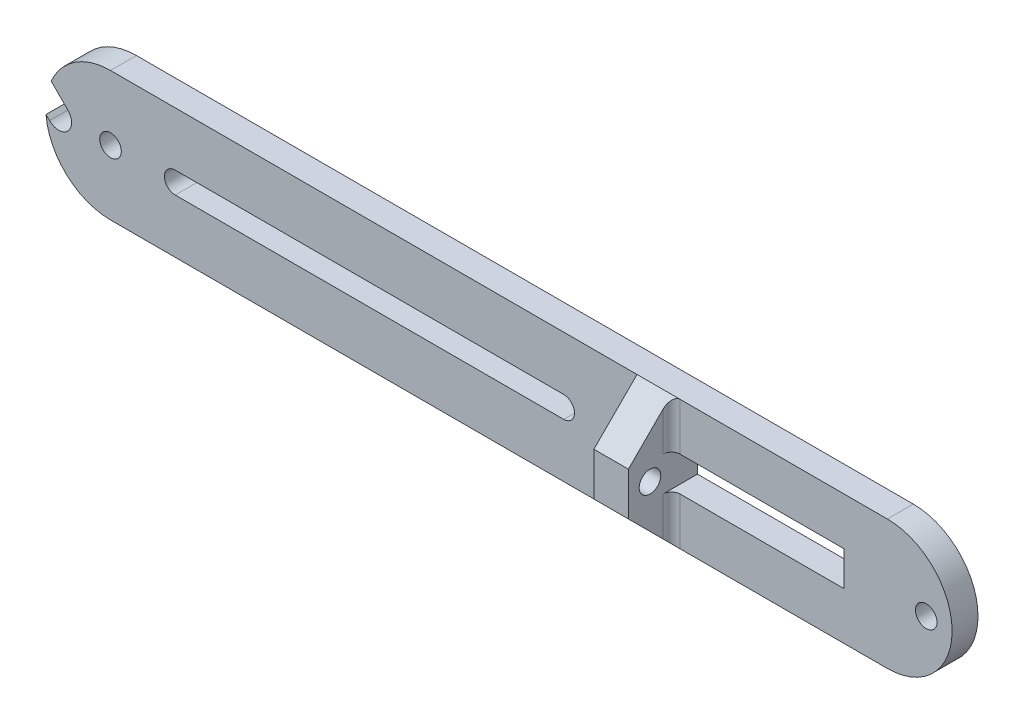
ISO-10303-21;
HEADER;
FILE_DESCRIPTION(('STEP AP214'),'2;1');
FILE_NAME('part.step','',(''),(''),'','','');
FILE_SCHEMA(('AUTOMOTIVE_DESIGN { 1 0 10303 214 1 1 1 1 }'));
ENDSEC;
DATA;
#1=APPLICATION_CONTEXT('core data for automotive mechanical design processes');
#2=APPLICATION_PROTOCOL_DEFINITION('international standard','automotive_design',2000,#1);
#3=PRODUCT_CONTEXT('',#1,'mechanical');
#4=PRODUCT('Part','Part','',(#3));
#5=PRODUCT_RELATED_PRODUCT_CATEGORY('part','',(#4));
#6=PRODUCT_DEFINITION_FORMATION('','',#4);
#7=PRODUCT_DEFINITION_CONTEXT('part definition',#1,'design');
#8=PRODUCT_DEFINITION('design','',#6,#7);
#9=PRODUCT_DEFINITION_SHAPE('','',#8);
#10=(LENGTH_UNIT() NAMED_UNIT(*) SI_UNIT(.MILLI.,.METRE.));
#11=(NAMED_UNIT(*) PLANE_ANGLE_UNIT() SI_UNIT($,.RADIAN.));
#12=(NAMED_UNIT(*) SI_UNIT($,.STERADIAN.) SOLID_ANGLE_UNIT());
#13=UNCERTAINTY_MEASURE_WITH_UNIT(LENGTH_MEASURE(1.E-05),#10,'distance_accuracy_value','');
#14=(GEOMETRIC_REPRESENTATION_CONTEXT(3) GLOBAL_UNCERTAINTY_ASSIGNED_CONTEXT((#13)) GLOBAL_UNIT_ASSIGNED_CONTEXT((#10,
#11,#12)) REPRESENTATION_CONTEXT('',''));
#15=CARTESIAN_POINT('',(0.,0.,0.));
#16=DIRECTION('',(0.,0.,1.));
#17=DIRECTION('',(1.,0.,0.));
#18=AXIS2_PLACEMENT_3D('',#15,#16,#17);
#19=CARTESIAN_POINT('',(90.,0.,6.));
#20=DIRECTION('',(0.,0.,1.));
#21=DIRECTION('',(1.,0.,0.));
#22=AXIS2_PLACEMENT_3D('',#19,#20,#21);
#23=PLANE('',#22);
#24=DIRECTION('',(-1.,0.,0.));
#25=VECTOR('',#24,1.);
#26=CARTESIAN_POINT('',(0.,2.5,6.));
#27=LINE('',#26,#25);
#28=CARTESIAN_POINT('',(15.,2.5,6.));
#29=VERTEX_POINT('',#28);
#30=CARTESIAN_POINT('',(-75.,2.50000000000001,6.));
#31=VERTEX_POINT('',#30);
#32=EDGE_CURVE('E442',#29,#31,#27,.T.);
#33=ORIENTED_EDGE('',*,*,#32,.F.);
#34=CARTESIAN_POINT('',(15.,0.,6.));
#35=DIRECTION('',(0.,0.,1.));
#36=DIRECTION('',(1.,0.,0.));
#37=AXIS2_PLACEMENT_3D('',#34,#35,#36);
#38=CIRCLE('',#37,2.5);
#39=CARTESIAN_POINT('',(15.,-2.5,6.));
#40=VERTEX_POINT('',#39);
#41=EDGE_CURVE('E439',#40,#29,#38,.T.);
#42=ORIENTED_EDGE('',*,*,#41,.F.);
#43=DIRECTION('',(1.,0.,0.));
#44=VECTOR('',#43,1.);
#45=CARTESIAN_POINT('',(15.,-2.5,6.));
#46=LINE('',#45,#44);
#47=CARTESIAN_POINT('',(-75.,-2.50000000000001,6.));
#48=VERTEX_POINT('',#47);
#49=EDGE_CURVE('E437',#48,#40,#46,.T.);
#50=ORIENTED_EDGE('',*,*,#49,.F.);
#51=CARTESIAN_POINT('',(-75.,0.,6.));
#52=DIRECTION('',(0.,0.,1.));
#53=DIRECTION('',(1.,0.,0.));
#54=AXIS2_PLACEMENT_3D('',#51,#52,#53);
#55=CIRCLE('',#54,2.50000000000001);
#56=EDGE_CURVE('E444',#31,#48,#55,.T.);
#57=ORIENTED_EDGE('',*,*,#56,.F.);
#58=EDGE_LOOP('',(#33,#42,#50,#57));
#59=FACE_BOUND('',#58,.T.);
#60=CARTESIAN_POINT('',(-90.,0.,6.));
#61=DIRECTION('',(0.,0.,1.));
#62=DIRECTION('',(-1.,0.,0.));
#63=AXIS2_PLACEMENT_3D('',#60,#61,#62);
#64=CIRCLE('',#63,2.5);
#65=CARTESIAN_POINT('',(-92.5,0.,6.));
#66=VERTEX_POINT('',#65);
#67=EDGE_CURVE('E412',#66,#66,#64,.T.);
#68=ORIENTED_EDGE('',*,*,#67,.F.);
#69=EDGE_LOOP('',(#68));
#70=FACE_BOUND('',#69,.T.);
#71=CARTESIAN_POINT('',(-102.,0.,6.));
#72=DIRECTION('',(0.,0.,1.));
#73=DIRECTION('',(1.,0.,0.));
#74=AXIS2_PLACEMENT_3D('',#71,#72,#73);
#75=CIRCLE('',#74,3.00000000000001);
#76=CARTESIAN_POINT('',(-104.12132034356,-2.12132034355964,6.));
#77=VERTEX_POINT('',#76);
#78=CARTESIAN_POINT('',(-99.8786796564403,2.12132034355964,6.));
#79=VERTEX_POINT('',#78);
#80=EDGE_CURVE('E224',#77,#79,#75,.T.);
#81=ORIENTED_EDGE('',*,*,#80,.F.);
#82=DIRECTION('',(-0.707106781186549,0.707106781186547,0.));
#83=VECTOR('',#82,1.);
#84=CARTESIAN_POINT('',(-53.1213203435595,-53.1213203435596,6.));
#85=LINE('',#84,#83);
#86=CARTESIAN_POINT('',(-104.943648089812,-1.29899259730732,6.));
#87=VERTEX_POINT('',#86);
#88=EDGE_CURVE('E230',#77,#87,#85,.T.);
#89=ORIENTED_EDGE('',*,*,#88,.T.);
#90=CARTESIAN_POINT('',(-90.,0.,6.));
#91=DIRECTION('',(0.,0.,1.));
#92=DIRECTION('',(-1.,0.,0.));
#93=AXIS2_PLACEMENT_3D('',#90,#91,#92);
#94=CIRCLE('',#93,15.);
#95=CARTESIAN_POINT('',(-90.,-15.,6.));
#96=VERTEX_POINT('',#95);
#97=EDGE_CURVE('E374',#87,#96,#94,.T.);
#98=ORIENTED_EDGE('',*,*,#97,.T.);
#99=DIRECTION('',(1.,0.,0.));
#100=VECTOR('',#99,1.);
#101=CARTESIAN_POINT('',(90.,-15.,6.));
#102=LINE('',#101,#100);
#103=CARTESIAN_POINT('',(32.,-15.,6.));
#104=VERTEX_POINT('',#103);
#105=EDGE_CURVE('E376',#96,#104,#102,.T.);
#106=ORIENTED_EDGE('',*,*,#105,.T.);
#107=DIRECTION('',(0.,1.,0.));
#108=VECTOR('',#107,1.);
#109=CARTESIAN_POINT('',(32.,-15.,6.));
#110=LINE('',#109,#108);
#111=CARTESIAN_POINT('',(32.,15.,6.));
#112=VERTEX_POINT('',#111);
#113=EDGE_CURVE('E302',#104,#112,#110,.T.);
#114=ORIENTED_EDGE('',*,*,#113,.T.);
#115=DIRECTION('',(-1.,0.,0.));
#116=VECTOR('',#115,1.);
#117=CARTESIAN_POINT('',(90.,15.,6.));
#118=LINE('',#117,#116);
#119=CARTESIAN_POINT('',(-90.,15.,6.));
#120=VERTEX_POINT('',#119);
#121=EDGE_CURVE('E372',#112,#120,#118,.T.);
#122=ORIENTED_EDGE('',*,*,#121,.T.);
#123=CARTESIAN_POINT('',(-103.750652312537,5.99329299965609,6.));
#124=VERTEX_POINT('',#123);
#125=EDGE_CURVE('E368',#120,#124,#94,.T.);
#126=ORIENTED_EDGE('',*,*,#125,.T.);
#127=DIRECTION('',(-0.707106781186548,0.707106781186547,0.));
#128=VECTOR('',#127,1.);
#129=CARTESIAN_POINT('',(-48.8786796564403,-48.8786796564403,6.));
#130=LINE('',#129,#128);
#131=EDGE_CURVE('E49',#79,#124,#130,.T.);
#132=ORIENTED_EDGE('',*,*,#131,.F.);
#133=EDGE_LOOP('',(#81,#89,#98,#106,#114,#122,#126,#132));
#134=FACE_BOUND('',#133,.T.);
#135=ADVANCED_FACE('F34',(#59,#70,#134),#23,.T.);
#136=CARTESIAN_POINT('',(90.,0.,0.));
#137=DIRECTION('',(0.,0.,1.));
#138=DIRECTION('',(1.,0.,0.));
#139=AXIS2_PLACEMENT_3D('',#136,#137,#138);
#140=PLANE('',#139);
#141=CARTESIAN_POINT('',(99.,0.,0.));
#142=DIRECTION('',(0.,0.,1.));
#143=DIRECTION('',(1.,0.,0.));
#144=AXIS2_PLACEMENT_3D('',#141,#142,#143);
#145=CIRCLE('',#144,2.49999999999999);
#146=CARTESIAN_POINT('',(101.5,0.,0.));
#147=VERTEX_POINT('',#146);
#148=EDGE_CURVE('E312',#147,#147,#145,.T.);
#149=ORIENTED_EDGE('',*,*,#148,.T.);
#150=EDGE_LOOP('',(#149));
#151=FACE_BOUND('',#150,.T.);
#152=CARTESIAN_POINT('',(-90.,0.,0.));
#153=DIRECTION('',(0.,0.,1.));
#154=DIRECTION('',(-1.,0.,0.));
#155=AXIS2_PLACEMENT_3D('',#152,#153,#154);
#156=CIRCLE('',#155,2.5);
#157=CARTESIAN_POINT('',(-92.5,0.,0.));
#158=VERTEX_POINT('',#157);
#159=EDGE_CURVE('E409',#158,#158,#156,.T.);
#160=ORIENTED_EDGE('',*,*,#159,.T.);
#161=EDGE_LOOP('',(#160));
#162=FACE_BOUND('',#161,.T.);
#163=DIRECTION('',(0.,1.,0.));
#164=VECTOR('',#163,1.);
#165=CARTESIAN_POINT('',(80.,-4.,0.));
#166=LINE('',#165,#164);
#167=CARTESIAN_POINT('',(80.,-4.,0.));
#168=VERTEX_POINT('',#167);
#169=CARTESIAN_POINT('',(80.,4.,0.));
#170=VERTEX_POINT('',#169);
#171=EDGE_CURVE('E415',#168,#170,#166,.T.);
#172=ORIENTED_EDGE('',*,*,#171,.T.);
#173=DIRECTION('',(-1.,0.,0.));
#174=VECTOR('',#173,1.);
#175=CARTESIAN_POINT('',(40.,4.,0.));
#176=LINE('',#175,#174);
#177=CARTESIAN_POINT('',(40.,4.,0.));
#178=VERTEX_POINT('',#177);
#179=EDGE_CURVE('E423',#170,#178,#176,.T.);
#180=ORIENTED_EDGE('',*,*,#179,.T.);
#181=DIRECTION('',(0.,-1.,0.));
#182=VECTOR('',#181,1.);
#183=CARTESIAN_POINT('',(40.,-4.,0.));
#184=LINE('',#183,#182);
#185=CARTESIAN_POINT('',(40.,-4.,0.));
#186=VERTEX_POINT('',#185);
#187=EDGE_CURVE('E426',#178,#186,#184,.T.);
#188=ORIENTED_EDGE('',*,*,#187,.T.);
#189=DIRECTION('',(1.,0.,0.));
#190=VECTOR('',#189,1.);
#191=CARTESIAN_POINT('',(40.,-4.,0.));
#192=LINE('',#191,#190);
#193=EDGE_CURVE('E420',#186,#168,#192,.T.);
#194=ORIENTED_EDGE('',*,*,#193,.T.);
#195=EDGE_LOOP('',(#172,#180,#188,#194));
#196=FACE_BOUND('',#195,.T.);
#197=CARTESIAN_POINT('',(15.,0.,0.));
#198=DIRECTION('',(0.,0.,1.));
#199=DIRECTION('',(1.,0.,0.));
#200=AXIS2_PLACEMENT_3D('',#197,#198,#199);
#201=CIRCLE('',#200,2.5);
#202=CARTESIAN_POINT('',(15.,-2.5,0.));
#203=VERTEX_POINT('',#202);
#204=CARTESIAN_POINT('',(15.,2.5,0.));
#205=VERTEX_POINT('',#204);
#206=EDGE_CURVE('E436',#203,#205,#201,.T.);
#207=ORIENTED_EDGE('',*,*,#206,.T.);
#208=DIRECTION('',(-1.,0.,0.));
#209=VECTOR('',#208,1.);
#210=CARTESIAN_POINT('',(0.,2.5,0.));
#211=LINE('',#210,#209);
#212=CARTESIAN_POINT('',(-75.,2.50000000000001,0.));
#213=VERTEX_POINT('',#212);
#214=EDGE_CURVE('E450',#205,#213,#211,.T.);
#215=ORIENTED_EDGE('',*,*,#214,.T.);
#216=CARTESIAN_POINT('',(-75.,0.,0.));
#217=DIRECTION('',(0.,0.,1.));
#218=DIRECTION('',(1.,0.,0.));
#219=AXIS2_PLACEMENT_3D('',#216,#217,#218);
#220=CIRCLE('',#219,2.50000000000001);
#221=CARTESIAN_POINT('',(-75.,-2.50000000000001,0.));
#222=VERTEX_POINT('',#221);
#223=EDGE_CURVE('E453',#213,#222,#220,.T.);
#224=ORIENTED_EDGE('',*,*,#223,.T.);
#225=DIRECTION('',(1.,0.,0.));
#226=VECTOR('',#225,1.);
#227=CARTESIAN_POINT('',(0.,-2.5,0.));
#228=LINE('',#227,#226);
#229=EDGE_CURVE('E440',#222,#203,#228,.T.);
#230=ORIENTED_EDGE('',*,*,#229,.T.);
#231=EDGE_LOOP('',(#207,#215,#224,#230));
#232=FACE_BOUND('',#231,.T.);
#233=DIRECTION('',(-0.707106781186549,0.707106781186547,0.));
#234=VECTOR('',#233,1.);
#235=CARTESIAN_POINT('',(-8.12132034355938,-98.1213203435596,0.));
#236=LINE('',#235,#234);
#237=CARTESIAN_POINT('',(-104.12132034356,-2.12132034355964,0.));
#238=VERTEX_POINT('',#237);
#239=CARTESIAN_POINT('',(-104.943648089812,-1.29899259730732,0.));
#240=VERTEX_POINT('',#239);
#241=EDGE_CURVE('E244',#238,#240,#236,.T.);
#242=ORIENTED_EDGE('',*,*,#241,.F.);
#243=CARTESIAN_POINT('',(-102.,0.,0.));
#244=DIRECTION('',(0.,0.,1.));
#245=DIRECTION('',(1.,0.,0.));
#246=AXIS2_PLACEMENT_3D('',#243,#244,#245);
#247=CIRCLE('',#246,3.00000000000001);
#248=CARTESIAN_POINT('',(-99.8786796564403,2.12132034355964,0.));
#249=VERTEX_POINT('',#248);
#250=EDGE_CURVE('E11',#238,#249,#247,.T.);
#251=ORIENTED_EDGE('',*,*,#250,.T.);
#252=DIRECTION('',(-0.707106781186548,0.707106781186547,0.));
#253=VECTOR('',#252,1.);
#254=CARTESIAN_POINT('',(-3.87867965644033,-93.8786796564403,0.));
#255=LINE('',#254,#253);
#256=CARTESIAN_POINT('',(-103.750652312537,5.99329299965609,0.));
#257=VERTEX_POINT('',#256);
#258=EDGE_CURVE('E240',#249,#257,#255,.T.);
#259=ORIENTED_EDGE('',*,*,#258,.T.);
#260=CARTESIAN_POINT('',(-90.,0.,0.));
#261=DIRECTION('',(0.,0.,1.));
#262=DIRECTION('',(-1.,0.,0.));
#263=AXIS2_PLACEMENT_3D('',#260,#261,#262);
#264=CIRCLE('',#263,15.);
#265=CARTESIAN_POINT('',(-90.,15.,0.));
#266=VERTEX_POINT('',#265);
#267=EDGE_CURVE('E370',#266,#257,#264,.T.);
#268=ORIENTED_EDGE('',*,*,#267,.F.);
#269=DIRECTION('',(-1.,0.,0.));
#270=VECTOR('',#269,1.);
#271=CARTESIAN_POINT('',(90.,15.,0.));
#272=LINE('',#271,#270);
#273=CARTESIAN_POINT('',(90.,15.,0.));
#274=VERTEX_POINT('',#273);
#275=EDGE_CURVE('E532',#274,#266,#272,.T.);
#276=ORIENTED_EDGE('',*,*,#275,.F.);
#277=CARTESIAN_POINT('',(90.,0.,0.));
#278=DIRECTION('',(0.,0.,1.));
#279=DIRECTION('',(1.,0.,0.));
#280=AXIS2_PLACEMENT_3D('',#277,#278,#279);
#281=CIRCLE('',#280,15.);
#282=CARTESIAN_POINT('',(90.,-15.,0.));
#283=VERTEX_POINT('',#282);
#284=EDGE_CURVE('E383',#283,#274,#281,.T.);
#285=ORIENTED_EDGE('',*,*,#284,.F.);
#286=DIRECTION('',(1.,0.,0.));
#287=VECTOR('',#286,1.);
#288=CARTESIAN_POINT('',(90.,-15.,0.));
#289=LINE('',#288,#287);
#290=CARTESIAN_POINT('',(-90.,-15.,0.));
#291=VERTEX_POINT('',#290);
#292=EDGE_CURVE('E467',#291,#283,#289,.T.);
#293=ORIENTED_EDGE('',*,*,#292,.F.);
#294=EDGE_CURVE('E477',#240,#291,#264,.T.);
#295=ORIENTED_EDGE('',*,*,#294,.F.);
#296=EDGE_LOOP('',(#242,#251,#259,#268,#276,#285,#293,#295));
#297=FACE_BOUND('',#296,.T.);
#298=ADVANCED_FACE('F513',(#151,#162,#196,#232,#297),#140,.F.);
#299=CARTESIAN_POINT('',(-90.,0.,6.));
#300=DIRECTION('',(0.,0.,-1.));
#301=DIRECTION('',(-1.,0.,0.));
#302=AXIS2_PLACEMENT_3D('',#299,#300,#301);
#303=CYLINDRICAL_SURFACE('',#302,15.);
#304=DIRECTION('',(0.,0.,-1.));
#305=VECTOR('',#304,1.);
#306=CARTESIAN_POINT('',(-104.943648089812,-1.29899259730732,6.));
#307=LINE('',#306,#305);
#308=EDGE_CURVE('E42',#240,#87,#307,.F.);
#309=ORIENTED_EDGE('',*,*,#308,.F.);
#310=ORIENTED_EDGE('',*,*,#294,.T.);
#311=DIRECTION('',(0.,0.,-1.));
#312=VECTOR('',#311,1.);
#313=CARTESIAN_POINT('',(-90.,-15.,6.));
#314=LINE('',#313,#312);
#315=EDGE_CURVE('E481',#96,#291,#314,.T.);
#316=ORIENTED_EDGE('',*,*,#315,.F.);
#317=ORIENTED_EDGE('',*,*,#97,.F.);
#318=EDGE_LOOP('',(#309,#310,#316,#317));
#319=FACE_BOUND('',#318,.T.);
#320=ADVANCED_FACE('F548',(#319),#303,.T.);
#321=CARTESIAN_POINT('',(90.,15.,6.));
#322=VERTEX_POINT('',#321);
#323=CARTESIAN_POINT('',(42.,15.,6.));
#324=VERTEX_POINT('',#323);
#325=EDGE_CURVE('E377',#322,#324,#118,.T.);
#326=ORIENTED_EDGE('',*,*,#325,.T.);
#327=DIRECTION('',(0.,1.,0.));
#328=VECTOR('',#327,1.);
#329=CARTESIAN_POINT('',(42.,4.,6.));
#330=LINE('',#329,#328);
#331=CARTESIAN_POINT('',(42.,4.,6.));
#332=VERTEX_POINT('',#331);
#333=EDGE_CURVE('E347',#324,#332,#330,.F.);
#334=ORIENTED_EDGE('',*,*,#333,.T.);
#335=DIRECTION('',(-1.,0.,0.));
#336=VECTOR('',#335,1.);
#337=CARTESIAN_POINT('',(40.,4.,6.));
#338=LINE('',#337,#336);
#339=CARTESIAN_POINT('',(80.,4.,6.));
#340=VERTEX_POINT('',#339);
#341=EDGE_CURVE('E335',#340,#332,#338,.T.);
#342=ORIENTED_EDGE('',*,*,#341,.F.);
#343=DIRECTION('',(0.,1.,0.));
#344=VECTOR('',#343,1.);
#345=CARTESIAN_POINT('',(80.,-4.,6.));
#346=LINE('',#345,#344);
#347=CARTESIAN_POINT('',(80.,-4.,6.));
#348=VERTEX_POINT('',#347);
#349=EDGE_CURVE('E418',#348,#340,#346,.T.);
#350=ORIENTED_EDGE('',*,*,#349,.F.);
#351=DIRECTION('',(1.,0.,0.));
#352=VECTOR('',#351,1.);
#353=CARTESIAN_POINT('',(40.,-4.,6.));
#354=LINE('',#353,#352);
#355=CARTESIAN_POINT('',(42.,-4.,6.));
#356=VERTEX_POINT('',#355);
#357=EDGE_CURVE('E338',#356,#348,#354,.T.);
#358=ORIENTED_EDGE('',*,*,#357,.F.);
#359=DIRECTION('',(0.,1.,0.));
#360=VECTOR('',#359,1.);
#361=CARTESIAN_POINT('',(42.,-15.,6.));
#362=LINE('',#361,#360);
#363=CARTESIAN_POINT('',(42.,-15.,6.));
#364=VERTEX_POINT('',#363);
#365=EDGE_CURVE('E344',#356,#364,#362,.F.);
#366=ORIENTED_EDGE('',*,*,#365,.T.);
#367=CARTESIAN_POINT('',(90.,-15.,6.));
#368=VERTEX_POINT('',#367);
#369=EDGE_CURVE('E341',#364,#368,#102,.T.);
#370=ORIENTED_EDGE('',*,*,#369,.T.);
#371=CARTESIAN_POINT('',(90.,0.,6.));
#372=DIRECTION('',(0.,0.,1.));
#373=DIRECTION('',(1.,0.,0.));
#374=AXIS2_PLACEMENT_3D('',#371,#372,#373);
#375=CIRCLE('',#374,15.);
#376=EDGE_CURVE('E465',#368,#322,#375,.T.);
#377=ORIENTED_EDGE('',*,*,#376,.T.);
#378=EDGE_LOOP('',(#326,#334,#342,#350,#358,#366,#370,#377));
#379=FACE_BOUND('',#378,.T.);
#380=CARTESIAN_POINT('',(99.,0.,6.));
#381=DIRECTION('',(0.,0.,1.));
#382=DIRECTION('',(1.,0.,0.));
#383=AXIS2_PLACEMENT_3D('',#380,#381,#382);
#384=CIRCLE('',#383,2.49999999999999);
#385=CARTESIAN_POINT('',(101.5,0.,6.));
#386=VERTEX_POINT('',#385);
#387=EDGE_CURVE('E406',#386,#386,#384,.T.);
#388=ORIENTED_EDGE('',*,*,#387,.F.);
#389=EDGE_LOOP('',(#388));
#390=FACE_BOUND('',#389,.T.);
#391=ADVANCED_FACE('F488',(#379,#390),#23,.T.);
#392=CARTESIAN_POINT('',(90.,0.,6.));
#393=DIRECTION('',(0.,0.,-1.));
#394=DIRECTION('',(-1.,0.,0.));
#395=AXIS2_PLACEMENT_3D('',#392,#393,#394);
#396=CYLINDRICAL_SURFACE('',#395,15.);
#397=ORIENTED_EDGE('',*,*,#284,.T.);
#398=DIRECTION('',(0.,0.,-1.));
#399=VECTOR('',#398,1.);
#400=CARTESIAN_POINT('',(90.,15.,6.));
#401=LINE('',#400,#399);
#402=EDGE_CURVE('E485',#322,#274,#401,.T.);
#403=ORIENTED_EDGE('',*,*,#402,.F.);
#404=ORIENTED_EDGE('',*,*,#376,.F.);
#405=DIRECTION('',(0.,0.,-1.));
#406=VECTOR('',#405,1.);
#407=CARTESIAN_POINT('',(90.,-15.,6.));
#408=LINE('',#407,#406);
#409=EDGE_CURVE('E390',#368,#283,#408,.T.);
#410=ORIENTED_EDGE('',*,*,#409,.T.);
#411=EDGE_LOOP('',(#397,#403,#404,#410));
#412=FACE_BOUND('',#411,.T.);
#413=ADVANCED_FACE('F530',(#412),#396,.T.);
#414=CARTESIAN_POINT('',(90.,15.,6.));
#415=DIRECTION('',(0.,-1.,0.));
#416=DIRECTION('',(0.,0.,-1.));
#417=AXIS2_PLACEMENT_3D('',#414,#415,#416);
#418=PLANE('',#417);
#419=ORIENTED_EDGE('',*,*,#275,.T.);
#420=DIRECTION('',(0.,0.,-1.));
#421=VECTOR('',#420,1.);
#422=CARTESIAN_POINT('',(-90.,15.,6.));
#423=LINE('',#422,#421);
#424=EDGE_CURVE('E483',#120,#266,#423,.T.);
#425=ORIENTED_EDGE('',*,*,#424,.F.);
#426=ORIENTED_EDGE('',*,*,#121,.F.);
#427=DIRECTION('',(1.,0.,0.));
#428=VECTOR('',#427,1.);
#429=CARTESIAN_POINT('',(32.,15.,6.));
#430=LINE('',#429,#428);
#431=EDGE_CURVE('E319',#112,#324,#430,.T.);
#432=ORIENTED_EDGE('',*,*,#431,.T.);
#433=ORIENTED_EDGE('',*,*,#325,.F.);
#434=ORIENTED_EDGE('',*,*,#402,.T.);
#435=EDGE_LOOP('',(#419,#425,#426,#432,#433,#434));
#436=FACE_BOUND('',#435,.T.);
#437=ADVANCED_FACE('F531',(#436),#418,.F.);
#438=ORIENTED_EDGE('',*,*,#267,.T.);
#439=DIRECTION('',(0.,0.,-1.));
#440=VECTOR('',#439,1.);
#441=CARTESIAN_POINT('',(-103.750652312537,5.99329299965609,6.));
#442=LINE('',#441,#440);
#443=EDGE_CURVE('E360',#257,#124,#442,.F.);
#444=ORIENTED_EDGE('',*,*,#443,.T.);
#445=ORIENTED_EDGE('',*,*,#125,.F.);
#446=ORIENTED_EDGE('',*,*,#424,.T.);
#447=EDGE_LOOP('',(#438,#444,#445,#446));
#448=FACE_BOUND('',#447,.T.);
#449=ADVANCED_FACE('F366',(#448),#303,.T.);
#450=CARTESIAN_POINT('',(90.,-15.,6.));
#451=DIRECTION('',(0.,1.,0.));
#452=DIRECTION('',(0.,0.,1.));
#453=AXIS2_PLACEMENT_3D('',#450,#451,#452);
#454=PLANE('',#453);
#455=ORIENTED_EDGE('',*,*,#292,.T.);
#456=ORIENTED_EDGE('',*,*,#409,.F.);
#457=ORIENTED_EDGE('',*,*,#369,.F.);
#458=DIRECTION('',(1.,0.,0.));
#459=VECTOR('',#458,1.);
#460=CARTESIAN_POINT('',(32.,-15.,6.));
#461=LINE('',#460,#459);
#462=EDGE_CURVE('E310',#104,#364,#461,.T.);
#463=ORIENTED_EDGE('',*,*,#462,.F.);
#464=ORIENTED_EDGE('',*,*,#105,.F.);
#465=ORIENTED_EDGE('',*,*,#315,.T.);
#466=EDGE_LOOP('',(#455,#456,#457,#463,#464,#465));
#467=FACE_BOUND('',#466,.T.);
#468=ADVANCED_FACE('F525',(#467),#454,.F.);
#469=CARTESIAN_POINT('',(15.,0.,6.));
#470=DIRECTION('',(0.,0.,-1.));
#471=DIRECTION('',(-1.,0.,0.));
#472=AXIS2_PLACEMENT_3D('',#469,#470,#471);
#473=CYLINDRICAL_SURFACE('',#472,2.5);
#474=ORIENTED_EDGE('',*,*,#206,.F.);
#475=DIRECTION('',(0.,0.,-1.));
#476=VECTOR('',#475,1.);
#477=CARTESIAN_POINT('',(15.,-2.5,6.));
#478=LINE('',#477,#476);
#479=EDGE_CURVE('E464',#40,#203,#478,.T.);
#480=ORIENTED_EDGE('',*,*,#479,.F.);
#481=ORIENTED_EDGE('',*,*,#41,.T.);
#482=DIRECTION('',(0.,0.,-1.));
#483=VECTOR('',#482,1.);
#484=CARTESIAN_POINT('',(15.,2.5,6.));
#485=LINE('',#484,#483);
#486=EDGE_CURVE('E461',#29,#205,#485,.T.);
#487=ORIENTED_EDGE('',*,*,#486,.T.);
#488=EDGE_LOOP('',(#474,#480,#481,#487));
#489=FACE_BOUND('',#488,.T.);
#490=ADVANCED_FACE('F571',(#489),#473,.F.);
#491=CARTESIAN_POINT('',(0.,2.5,6.));
#492=DIRECTION('',(0.,-1.,0.));
#493=DIRECTION('',(1.,0.,0.));
#494=AXIS2_PLACEMENT_3D('',#491,#492,#493);
#495=PLANE('',#494);
#496=ORIENTED_EDGE('',*,*,#214,.F.);
#497=ORIENTED_EDGE('',*,*,#486,.F.);
#498=ORIENTED_EDGE('',*,*,#32,.T.);
#499=DIRECTION('',(0.,0.,-1.));
#500=VECTOR('',#499,1.);
#501=CARTESIAN_POINT('',(-75.,2.50000000000001,6.));
#502=LINE('',#501,#500);
#503=EDGE_CURVE('E459',#31,#213,#502,.T.);
#504=ORIENTED_EDGE('',*,*,#503,.T.);
#505=EDGE_LOOP('',(#496,#497,#498,#504));
#506=FACE_BOUND('',#505,.T.);
#507=ADVANCED_FACE('F627',(#506),#495,.T.);
#508=CARTESIAN_POINT('',(-75.,0.,6.));
#509=DIRECTION('',(0.,0.,-1.));
#510=DIRECTION('',(-1.,0.,0.));
#511=AXIS2_PLACEMENT_3D('',#508,#509,#510);
#512=CYLINDRICAL_SURFACE('',#511,2.50000000000001);
#513=ORIENTED_EDGE('',*,*,#223,.F.);
#514=ORIENTED_EDGE('',*,*,#503,.F.);
#515=ORIENTED_EDGE('',*,*,#56,.T.);
#516=DIRECTION('',(0.,0.,-1.));
#517=VECTOR('',#516,1.);
#518=CARTESIAN_POINT('',(-75.,-2.50000000000001,6.));
#519=LINE('',#518,#517);
#520=EDGE_CURVE('E447',#48,#222,#519,.T.);
#521=ORIENTED_EDGE('',*,*,#520,.T.);
#522=EDGE_LOOP('',(#513,#514,#515,#521));
#523=FACE_BOUND('',#522,.T.);
#524=ADVANCED_FACE('F623',(#523),#512,.F.);
#525=CARTESIAN_POINT('',(0.,-2.5,6.));
#526=DIRECTION('',(0.,1.,0.));
#527=DIRECTION('',(-1.,0.,0.));
#528=AXIS2_PLACEMENT_3D('',#525,#526,#527);
#529=PLANE('',#528);
#530=ORIENTED_EDGE('',*,*,#229,.F.);
#531=ORIENTED_EDGE('',*,*,#520,.F.);
#532=ORIENTED_EDGE('',*,*,#49,.T.);
#533=ORIENTED_EDGE('',*,*,#479,.T.);
#534=EDGE_LOOP('',(#530,#531,#532,#533));
#535=FACE_BOUND('',#534,.T.);
#536=ADVANCED_FACE('F620',(#535),#529,.T.);
#537=CARTESIAN_POINT('',(80.,-4.,6.));
#538=DIRECTION('',(-1.,0.,0.));
#539=DIRECTION('',(0.,0.,1.));
#540=AXIS2_PLACEMENT_3D('',#537,#538,#539);
#541=PLANE('',#540);
#542=ORIENTED_EDGE('',*,*,#171,.F.);
#543=DIRECTION('',(0.,0.,-1.));
#544=VECTOR('',#543,1.);
#545=CARTESIAN_POINT('',(80.,-4.,6.));
#546=LINE('',#545,#544);
#547=EDGE_CURVE('E330',#348,#168,#546,.T.);
#548=ORIENTED_EDGE('',*,*,#547,.F.);
#549=ORIENTED_EDGE('',*,*,#349,.T.);
#550=DIRECTION('',(0.,0.,-1.));
#551=VECTOR('',#550,1.);
#552=CARTESIAN_POINT('',(80.,4.,6.));
#553=LINE('',#552,#551);
#554=EDGE_CURVE('E433',#340,#170,#553,.T.);
#555=ORIENTED_EDGE('',*,*,#554,.T.);
#556=EDGE_LOOP('',(#542,#548,#549,#555));
#557=FACE_BOUND('',#556,.T.);
#558=ADVANCED_FACE('F508',(#557),#541,.T.);
#559=CARTESIAN_POINT('',(40.,4.,6.));
#560=DIRECTION('',(0.,-1.,0.));
#561=DIRECTION('',(0.,0.,-1.));
#562=AXIS2_PLACEMENT_3D('',#559,#560,#561);
#563=PLANE('',#562);
#564=ORIENTED_EDGE('',*,*,#179,.F.);
#565=ORIENTED_EDGE('',*,*,#554,.F.);
#566=ORIENTED_EDGE('',*,*,#341,.T.);
#567=CARTESIAN_POINT('',(42.,4.,8.));
#568=DIRECTION('',(0.,-1.,0.));
#569=DIRECTION('',(0.,0.,-1.));
#570=AXIS2_PLACEMENT_3D('',#567,#568,#569);
#571=CIRCLE('',#570,2.);
#572=CARTESIAN_POINT('',(40.,4.,8.));
#573=VERTEX_POINT('',#572);
#574=EDGE_CURVE('E353',#332,#573,#571,.F.);
#575=ORIENTED_EDGE('',*,*,#574,.T.);
#576=DIRECTION('',(0.,0.,-1.));
#577=VECTOR('',#576,1.);
#578=CARTESIAN_POINT('',(40.,4.,6.));
#579=LINE('',#578,#577);
#580=EDGE_CURVE('E329',#573,#178,#579,.T.);
#581=ORIENTED_EDGE('',*,*,#580,.T.);
#582=EDGE_LOOP('',(#564,#565,#566,#575,#581));
#583=FACE_BOUND('',#582,.T.);
#584=ADVANCED_FACE('F500',(#583),#563,.T.);
#585=CARTESIAN_POINT('',(40.,-4.,6.));
#586=DIRECTION('',(1.,0.,0.));
#587=DIRECTION('',(0.,0.,-1.));
#588=AXIS2_PLACEMENT_3D('',#585,#586,#587);
#589=PLANE('',#588);
#590=ORIENTED_EDGE('',*,*,#580,.F.);
#591=DIRECTION('',(0.,1.,0.));
#592=VECTOR('',#591,1.);
#593=CARTESIAN_POINT('',(40.,15.,8.));
#594=LINE('',#593,#592);
#595=CARTESIAN_POINT('',(40.,13.,8.));
#596=VERTEX_POINT('',#595);
#597=EDGE_CURVE('E348',#573,#596,#594,.T.);
#598=ORIENTED_EDGE('',*,*,#597,.T.);
#599=DIRECTION('',(0.,-0.707106781186548,0.707106781186548));
#600=VECTOR('',#599,1.);
#601=CARTESIAN_POINT('',(40.,15.,6.));
#602=LINE('',#601,#600);
#603=CARTESIAN_POINT('',(40.,5.,16.));
#604=VERTEX_POINT('',#603);
#605=EDGE_CURVE('E296',#596,#604,#602,.T.);
#606=ORIENTED_EDGE('',*,*,#605,.T.);
#607=DIRECTION('',(0.,-1.,0.));
#608=VECTOR('',#607,1.);
#609=CARTESIAN_POINT('',(40.,5.,16.));
#610=LINE('',#609,#608);
#611=CARTESIAN_POINT('',(40.,-5.,16.));
#612=VERTEX_POINT('',#611);
#613=EDGE_CURVE('E324',#604,#612,#610,.T.);
#614=ORIENTED_EDGE('',*,*,#613,.T.);
#615=DIRECTION('',(0.,-0.707106781186547,-0.707106781186548));
#616=VECTOR('',#615,1.);
#617=CARTESIAN_POINT('',(40.,-15.,6.));
#618=LINE('',#617,#616);
#619=CARTESIAN_POINT('',(40.,-13.,8.));
#620=VERTEX_POINT('',#619);
#621=EDGE_CURVE('E307',#612,#620,#618,.T.);
#622=ORIENTED_EDGE('',*,*,#621,.T.);
#623=DIRECTION('',(0.,1.,0.));
#624=VECTOR('',#623,1.);
#625=CARTESIAN_POINT('',(40.,-4.,8.));
#626=LINE('',#625,#624);
#627=CARTESIAN_POINT('',(40.,-4.,8.));
#628=VERTEX_POINT('',#627);
#629=EDGE_CURVE('E487',#620,#628,#626,.T.);
#630=ORIENTED_EDGE('',*,*,#629,.T.);
#631=DIRECTION('',(0.,0.,-1.));
#632=VECTOR('',#631,1.);
#633=CARTESIAN_POINT('',(40.,-4.,6.));
#634=LINE('',#633,#632);
#635=EDGE_CURVE('E327',#628,#186,#634,.T.);
#636=ORIENTED_EDGE('',*,*,#635,.T.);
#637=ORIENTED_EDGE('',*,*,#187,.F.);
#638=EDGE_LOOP('',(#590,#598,#606,#614,#622,#630,#636,#637));
#639=FACE_BOUND('',#638,.T.);
#640=CARTESIAN_POINT('',(40.,0.,11.));
#641=DIRECTION('',(1.,0.,0.));
#642=DIRECTION('',(0.,0.,-1.));
#643=AXIS2_PLACEMENT_3D('',#640,#641,#642);
#644=CIRCLE('',#643,2.5);
#645=CARTESIAN_POINT('',(40.,0.,8.5));
#646=VERTEX_POINT('',#645);
#647=EDGE_CURVE('E293',#646,#646,#644,.T.);
#648=ORIENTED_EDGE('',*,*,#647,.F.);
#649=EDGE_LOOP('',(#648));
#650=FACE_BOUND('',#649,.T.);
#651=ADVANCED_FACE('F516',(#639,#650),#589,.T.);
#652=CARTESIAN_POINT('',(40.,-4.,6.));
#653=DIRECTION('',(0.,1.,0.));
#654=DIRECTION('',(0.,0.,1.));
#655=AXIS2_PLACEMENT_3D('',#652,#653,#654);
#656=PLANE('',#655);
#657=ORIENTED_EDGE('',*,*,#193,.F.);
#658=ORIENTED_EDGE('',*,*,#635,.F.);
#659=CARTESIAN_POINT('',(42.,-4.,8.));
#660=DIRECTION('',(0.,1.,0.));
#661=DIRECTION('',(0.,0.,1.));
#662=AXIS2_PLACEMENT_3D('',#659,#660,#661);
#663=CIRCLE('',#662,2.);
#664=EDGE_CURVE('E356',#628,#356,#663,.F.);
#665=ORIENTED_EDGE('',*,*,#664,.T.);
#666=ORIENTED_EDGE('',*,*,#357,.T.);
#667=ORIENTED_EDGE('',*,*,#547,.T.);
#668=EDGE_LOOP('',(#657,#658,#665,#666,#667));
#669=FACE_BOUND('',#668,.T.);
#670=ADVANCED_FACE('F511',(#669),#656,.T.);
#671=CARTESIAN_POINT('',(-90.,0.,6.));
#672=DIRECTION('',(0.,0.,-1.));
#673=DIRECTION('',(-1.,0.,0.));
#674=AXIS2_PLACEMENT_3D('',#671,#672,#673);
#675=CYLINDRICAL_SURFACE('',#674,2.5);
#676=ORIENTED_EDGE('',*,*,#67,.T.);
#677=EDGE_LOOP('',(#676));
#678=FACE_BOUND('',#677,.T.);
#679=ORIENTED_EDGE('',*,*,#159,.F.);
#680=EDGE_LOOP('',(#679));
#681=FACE_BOUND('',#680,.T.);
#682=ADVANCED_FACE('F607',(#678,#681),#675,.F.);
#683=CARTESIAN_POINT('',(99.,0.,6.));
#684=DIRECTION('',(0.,0.,-1.));
#685=DIRECTION('',(-1.,0.,0.));
#686=AXIS2_PLACEMENT_3D('',#683,#684,#685);
#687=CYLINDRICAL_SURFACE('',#686,2.49999999999999);
#688=ORIENTED_EDGE('',*,*,#387,.T.);
#689=EDGE_LOOP('',(#688));
#690=FACE_BOUND('',#689,.T.);
#691=ORIENTED_EDGE('',*,*,#148,.F.);
#692=EDGE_LOOP('',(#691));
#693=FACE_BOUND('',#692,.T.);
#694=ADVANCED_FACE('F598',(#690,#693),#687,.F.);
#695=CARTESIAN_POINT('',(32.,-15.,6.));
#696=DIRECTION('',(0.,-0.707106781186548,0.707106781186547));
#697=DIRECTION('',(0.,-0.707106781186547,-0.707106781186548));
#698=AXIS2_PLACEMENT_3D('',#695,#696,#697);
#699=PLANE('',#698);
#700=ORIENTED_EDGE('',*,*,#621,.F.);
#701=DIRECTION('',(1.,0.,0.));
#702=VECTOR('',#701,1.);
#703=CARTESIAN_POINT('',(32.,-5.,16.));
#704=LINE('',#703,#702);
#705=CARTESIAN_POINT('',(32.,-5.,16.));
#706=VERTEX_POINT('',#705);
#707=EDGE_CURVE('E313',#706,#612,#704,.T.);
#708=ORIENTED_EDGE('',*,*,#707,.F.);
#709=DIRECTION('',(0.,-0.707106781186547,-0.707106781186548));
#710=VECTOR('',#709,1.);
#711=CARTESIAN_POINT('',(32.,-15.,6.));
#712=LINE('',#711,#710);
#713=EDGE_CURVE('E316',#706,#104,#712,.T.);
#714=ORIENTED_EDGE('',*,*,#713,.T.);
#715=ORIENTED_EDGE('',*,*,#462,.T.);
#716=CARTESIAN_POINT('',(42.,-13.,8.));
#717=DIRECTION('',(0.,-0.707106781186548,0.707106781186547));
#718=DIRECTION('',(0.,-0.707106781186547,-0.707106781186548));
#719=AXIS2_PLACEMENT_3D('',#716,#717,#718);
#720=ELLIPSE('',#719,2.82842712474619,2.);
#721=EDGE_CURVE('E358',#364,#620,#720,.F.);
#722=ORIENTED_EDGE('',*,*,#721,.T.);
#723=EDGE_LOOP('',(#700,#708,#714,#715,#722));
#724=FACE_BOUND('',#723,.T.);
#725=ADVANCED_FACE('F594',(#724),#699,.T.);
#726=CARTESIAN_POINT('',(32.,5.,16.));
#727=DIRECTION('',(0.,0.,1.));
#728=DIRECTION('',(1.,0.,0.));
#729=AXIS2_PLACEMENT_3D('',#726,#727,#728);
#730=PLANE('',#729);
#731=ORIENTED_EDGE('',*,*,#613,.F.);
#732=DIRECTION('',(1.,0.,0.));
#733=VECTOR('',#732,1.);
#734=CARTESIAN_POINT('',(32.,5.,16.));
#735=LINE('',#734,#733);
#736=CARTESIAN_POINT('',(32.,5.,16.));
#737=VERTEX_POINT('',#736);
#738=EDGE_CURVE('E395',#737,#604,#735,.T.);
#739=ORIENTED_EDGE('',*,*,#738,.F.);
#740=DIRECTION('',(0.,-1.,0.));
#741=VECTOR('',#740,1.);
#742=CARTESIAN_POINT('',(32.,5.,16.));
#743=LINE('',#742,#741);
#744=EDGE_CURVE('E299',#737,#706,#743,.T.);
#745=ORIENTED_EDGE('',*,*,#744,.T.);
#746=ORIENTED_EDGE('',*,*,#707,.T.);
#747=EDGE_LOOP('',(#731,#739,#745,#746));
#748=FACE_BOUND('',#747,.T.);
#749=ADVANCED_FACE('F597',(#748),#730,.T.);
#750=CARTESIAN_POINT('',(32.,15.,6.));
#751=DIRECTION('',(0.,0.707106781186547,0.707106781186547));
#752=DIRECTION('',(0.,-0.707106781186548,0.707106781186548));
#753=AXIS2_PLACEMENT_3D('',#750,#751,#752);
#754=PLANE('',#753);
#755=ORIENTED_EDGE('',*,*,#605,.F.);
#756=CARTESIAN_POINT('',(42.,13.,8.));
#757=DIRECTION('',(0.,0.707106781186547,0.707106781186547));
#758=DIRECTION('',(0.,-0.707106781186548,0.707106781186548));
#759=AXIS2_PLACEMENT_3D('',#756,#757,#758);
#760=ELLIPSE('',#759,2.82842712474619,2.);
#761=EDGE_CURVE('E350',#596,#324,#760,.F.);
#762=ORIENTED_EDGE('',*,*,#761,.T.);
#763=ORIENTED_EDGE('',*,*,#431,.F.);
#764=DIRECTION('',(0.,-0.707106781186548,0.707106781186548));
#765=VECTOR('',#764,1.);
#766=CARTESIAN_POINT('',(32.,15.,6.));
#767=LINE('',#766,#765);
#768=EDGE_CURVE('E306',#112,#737,#767,.T.);
#769=ORIENTED_EDGE('',*,*,#768,.T.);
#770=ORIENTED_EDGE('',*,*,#738,.T.);
#771=EDGE_LOOP('',(#755,#762,#763,#769,#770));
#772=FACE_BOUND('',#771,.T.);
#773=ADVANCED_FACE('F493',(#772),#754,.T.);
#774=CARTESIAN_POINT('',(32.,0.,0.));
#775=DIRECTION('',(1.,0.,0.));
#776=DIRECTION('',(0.,0.,-1.));
#777=AXIS2_PLACEMENT_3D('',#774,#775,#776);
#778=PLANE('',#777);
#779=DIRECTION('',(0.,0.500000000000001,-0.866025403784438));
#780=VECTOR('',#779,1.);
#781=CARTESIAN_POINT('',(32.,4.,11.));
#782=LINE('',#781,#780);
#783=CARTESIAN_POINT('',(32.,1.99999999999999,14.4641016151378));
#784=VERTEX_POINT('',#783);
#785=CARTESIAN_POINT('',(32.,4.,11.));
#786=VERTEX_POINT('',#785);
#787=EDGE_CURVE('E267',#784,#786,#782,.T.);
#788=ORIENTED_EDGE('',*,*,#787,.F.);
#789=DIRECTION('',(0.,1.,0.));
#790=VECTOR('',#789,1.);
#791=CARTESIAN_POINT('',(32.,1.99999999999999,14.4641016151378));
#792=LINE('',#791,#790);
#793=CARTESIAN_POINT('',(32.,-2.00000000000002,14.4641016151377));
#794=VERTEX_POINT('',#793);
#795=EDGE_CURVE('E57',#794,#784,#792,.T.);
#796=ORIENTED_EDGE('',*,*,#795,.F.);
#797=DIRECTION('',(0.,0.499999999999998,0.86602540378444));
#798=VECTOR('',#797,1.);
#799=CARTESIAN_POINT('',(32.,-2.00000000000002,14.4641016151377));
#800=LINE('',#799,#798);
#801=CARTESIAN_POINT('',(32.,-4.,11.));
#802=VERTEX_POINT('',#801);
#803=EDGE_CURVE('E250',#802,#794,#800,.T.);
#804=ORIENTED_EDGE('',*,*,#803,.F.);
#805=DIRECTION('',(0.,-0.499999999999998,0.86602540378444));
#806=VECTOR('',#805,1.);
#807=CARTESIAN_POINT('',(32.,-2.00000000000002,7.53589838486225));
#808=LINE('',#807,#806);
#809=CARTESIAN_POINT('',(32.,-2.00000000000002,7.53589838486225));
#810=VERTEX_POINT('',#809);
#811=EDGE_CURVE('E276',#810,#802,#808,.T.);
#812=ORIENTED_EDGE('',*,*,#811,.F.);
#813=DIRECTION('',(0.,-1.,0.));
#814=VECTOR('',#813,1.);
#815=CARTESIAN_POINT('',(32.,1.99999999999999,7.53589838486224));
#816=LINE('',#815,#814);
#817=CARTESIAN_POINT('',(32.,1.99999999999999,7.53589838486224));
#818=VERTEX_POINT('',#817);
#819=EDGE_CURVE('E273',#818,#810,#816,.T.);
#820=ORIENTED_EDGE('',*,*,#819,.F.);
#821=DIRECTION('',(0.,-0.500000000000001,-0.866025403784438));
#822=VECTOR('',#821,1.);
#823=CARTESIAN_POINT('',(32.,4.,11.));
#824=LINE('',#823,#822);
#825=EDGE_CURVE('E270',#786,#818,#824,.T.);
#826=ORIENTED_EDGE('',*,*,#825,.F.);
#827=EDGE_LOOP('',(#788,#796,#804,#812,#820,#826));
#828=FACE_BOUND('',#827,.T.);
#829=ORIENTED_EDGE('',*,*,#113,.F.);
#830=ORIENTED_EDGE('',*,*,#713,.F.);
#831=ORIENTED_EDGE('',*,*,#744,.F.);
#832=ORIENTED_EDGE('',*,*,#768,.F.);
#833=EDGE_LOOP('',(#829,#830,#831,#832));
#834=FACE_BOUND('',#833,.T.);
#835=ADVANCED_FACE('F581',(#828,#834),#778,.F.);
#836=CARTESIAN_POINT('',(32.,0.,11.));
#837=DIRECTION('',(1.,0.,0.));
#838=DIRECTION('',(0.,0.,-1.));
#839=AXIS2_PLACEMENT_3D('',#836,#837,#838);
#840=CYLINDRICAL_SURFACE('',#839,2.5);
#841=CARTESIAN_POINT('',(36.,0.,11.));
#842=DIRECTION('',(1.,0.,0.));
#843=DIRECTION('',(0.,0.,-1.));
#844=AXIS2_PLACEMENT_3D('',#841,#842,#843);
#845=CIRCLE('',#844,2.5);
#846=CARTESIAN_POINT('',(36.,0.,8.5));
#847=VERTEX_POINT('',#846);
#848=EDGE_CURVE('E283',#847,#847,#845,.F.);
#849=ORIENTED_EDGE('',*,*,#848,.T.);
#850=EDGE_LOOP('',(#849));
#851=FACE_BOUND('',#850,.T.);
#852=ORIENTED_EDGE('',*,*,#647,.T.);
#853=EDGE_LOOP('',(#852));
#854=FACE_BOUND('',#853,.T.);
#855=ADVANCED_FACE('F575',(#851,#854),#840,.F.);
#856=CARTESIAN_POINT('',(42.,-4.,8.));
#857=DIRECTION('',(0.,-1.,0.));
#858=DIRECTION('',(0.,0.,-1.));
#859=AXIS2_PLACEMENT_3D('',#856,#857,#858);
#860=CYLINDRICAL_SURFACE('',#859,2.);
#861=ORIENTED_EDGE('',*,*,#574,.F.);
#862=ORIENTED_EDGE('',*,*,#333,.F.);
#863=ORIENTED_EDGE('',*,*,#761,.F.);
#864=ORIENTED_EDGE('',*,*,#597,.F.);
#865=EDGE_LOOP('',(#861,#862,#863,#864));
#866=FACE_BOUND('',#865,.T.);
#867=ADVANCED_FACE('F498',(#866),#860,.F.);
#868=CARTESIAN_POINT('',(42.,-4.,8.));
#869=DIRECTION('',(0.,-1.,0.));
#870=DIRECTION('',(0.,0.,-1.));
#871=AXIS2_PLACEMENT_3D('',#868,#869,#870);
#872=CYLINDRICAL_SURFACE('',#871,2.);
#873=ORIENTED_EDGE('',*,*,#721,.F.);
#874=ORIENTED_EDGE('',*,*,#365,.F.);
#875=ORIENTED_EDGE('',*,*,#664,.F.);
#876=ORIENTED_EDGE('',*,*,#629,.F.);
#877=EDGE_LOOP('',(#873,#874,#875,#876));
#878=FACE_BOUND('',#877,.T.);
#879=ADVANCED_FACE('F36',(#878),#872,.F.);
#880=CARTESIAN_POINT('',(36.,0.,0.));
#881=DIRECTION('',(1.,0.,0.));
#882=DIRECTION('',(0.,0.,-1.));
#883=AXIS2_PLACEMENT_3D('',#880,#881,#882);
#884=PLANE('',#883);
#885=DIRECTION('',(0.,1.,0.));
#886=VECTOR('',#885,1.);
#887=CARTESIAN_POINT('',(36.,1.99999999999999,14.4641016151378));
#888=LINE('',#887,#886);
#889=CARTESIAN_POINT('',(36.,-2.00000000000002,14.4641016151377));
#890=VERTEX_POINT('',#889);
#891=CARTESIAN_POINT('',(36.,1.99999999999999,14.4641016151378));
#892=VERTEX_POINT('',#891);
#893=EDGE_CURVE('E246',#890,#892,#888,.T.);
#894=ORIENTED_EDGE('',*,*,#893,.T.);
#895=DIRECTION('',(0.,0.500000000000001,-0.866025403784438));
#896=VECTOR('',#895,1.);
#897=CARTESIAN_POINT('',(36.,4.,11.));
#898=LINE('',#897,#896);
#899=CARTESIAN_POINT('',(36.,4.,11.));
#900=VERTEX_POINT('',#899);
#901=EDGE_CURVE('E249',#892,#900,#898,.T.);
#902=ORIENTED_EDGE('',*,*,#901,.T.);
#903=DIRECTION('',(0.,-0.500000000000001,-0.866025403784438));
#904=VECTOR('',#903,1.);
#905=CARTESIAN_POINT('',(36.,4.,11.));
#906=LINE('',#905,#904);
#907=CARTESIAN_POINT('',(36.,1.99999999999999,7.53589838486224));
#908=VERTEX_POINT('',#907);
#909=EDGE_CURVE('E253',#900,#908,#906,.T.);
#910=ORIENTED_EDGE('',*,*,#909,.T.);
#911=DIRECTION('',(0.,-1.,0.));
#912=VECTOR('',#911,1.);
#913=CARTESIAN_POINT('',(36.,1.99999999999999,7.53589838486224));
#914=LINE('',#913,#912);
#915=CARTESIAN_POINT('',(36.,-2.00000000000002,7.53589838486225));
#916=VERTEX_POINT('',#915);
#917=EDGE_CURVE('E256',#908,#916,#914,.T.);
#918=ORIENTED_EDGE('',*,*,#917,.T.);
#919=DIRECTION('',(0.,-0.499999999999998,0.86602540378444));
#920=VECTOR('',#919,1.);
#921=CARTESIAN_POINT('',(36.,-2.00000000000002,7.53589838486225));
#922=LINE('',#921,#920);
#923=CARTESIAN_POINT('',(36.,-4.,11.));
#924=VERTEX_POINT('',#923);
#925=EDGE_CURVE('E259',#916,#924,#922,.T.);
#926=ORIENTED_EDGE('',*,*,#925,.T.);
#927=DIRECTION('',(0.,0.499999999999998,0.86602540378444));
#928=VECTOR('',#927,1.);
#929=CARTESIAN_POINT('',(36.,-2.00000000000002,14.4641016151377));
#930=LINE('',#929,#928);
#931=EDGE_CURVE('E262',#924,#890,#930,.T.);
#932=ORIENTED_EDGE('',*,*,#931,.T.);
#933=EDGE_LOOP('',(#894,#902,#910,#918,#926,#932));
#934=FACE_BOUND('',#933,.T.);
#935=ORIENTED_EDGE('',*,*,#848,.F.);
#936=EDGE_LOOP('',(#935));
#937=FACE_BOUND('',#936,.T.);
#938=ADVANCED_FACE('F580',(#934,#937),#884,.F.);
#939=CARTESIAN_POINT('',(36.,1.99999999999999,14.4641016151378));
#940=DIRECTION('',(0.,0.,1.));
#941=DIRECTION('',(0.,-1.,0.));
#942=AXIS2_PLACEMENT_3D('',#939,#940,#941);
#943=PLANE('',#942);
#944=ORIENTED_EDGE('',*,*,#795,.T.);
#945=DIRECTION('',(-1.,0.,0.));
#946=VECTOR('',#945,1.);
#947=CARTESIAN_POINT('',(36.,1.99999999999999,14.4641016151378));
#948=LINE('',#947,#946);
#949=EDGE_CURVE('E265',#892,#784,#948,.T.);
#950=ORIENTED_EDGE('',*,*,#949,.F.);
#951=ORIENTED_EDGE('',*,*,#893,.F.);
#952=DIRECTION('',(-1.,0.,0.));
#953=VECTOR('',#952,1.);
#954=CARTESIAN_POINT('',(36.,-2.00000000000002,14.4641016151377));
#955=LINE('',#954,#953);
#956=EDGE_CURVE('E281',#890,#794,#955,.T.);
#957=ORIENTED_EDGE('',*,*,#956,.T.);
#958=EDGE_LOOP('',(#944,#950,#951,#957));
#959=FACE_BOUND('',#958,.T.);
#960=ADVANCED_FACE('F591',(#959),#943,.F.);
#961=CARTESIAN_POINT('',(36.,-2.00000000000002,14.4641016151377));
#962=DIRECTION('',(0.,-0.86602540378444,0.499999999999998));
#963=DIRECTION('',(0.,-0.499999999999998,-0.86602540378444));
#964=AXIS2_PLACEMENT_3D('',#961,#962,#963);
#965=PLANE('',#964);
#966=ORIENTED_EDGE('',*,*,#803,.T.);
#967=ORIENTED_EDGE('',*,*,#956,.F.);
#968=ORIENTED_EDGE('',*,*,#931,.F.);
#969=DIRECTION('',(-1.,0.,0.));
#970=VECTOR('',#969,1.);
#971=CARTESIAN_POINT('',(36.,-4.,11.));
#972=LINE('',#971,#970);
#973=EDGE_CURVE('E284',#924,#802,#972,.T.);
#974=ORIENTED_EDGE('',*,*,#973,.T.);
#975=EDGE_LOOP('',(#966,#967,#968,#974));
#976=FACE_BOUND('',#975,.T.);
#977=ADVANCED_FACE('F725',(#976),#965,.F.);
#978=CARTESIAN_POINT('',(36.,-2.00000000000002,7.53589838486225));
#979=DIRECTION('',(0.,-0.86602540378444,-0.499999999999998));
#980=DIRECTION('',(0.,0.499999999999998,-0.86602540378444));
#981=AXIS2_PLACEMENT_3D('',#978,#979,#980);
#982=PLANE('',#981);
#983=ORIENTED_EDGE('',*,*,#811,.T.);
#984=ORIENTED_EDGE('',*,*,#973,.F.);
#985=ORIENTED_EDGE('',*,*,#925,.F.);
#986=DIRECTION('',(-1.,0.,0.));
#987=VECTOR('',#986,1.);
#988=CARTESIAN_POINT('',(36.,-2.00000000000002,7.53589838486225));
#989=LINE('',#988,#987);
#990=EDGE_CURVE('E286',#916,#810,#989,.T.);
#991=ORIENTED_EDGE('',*,*,#990,.T.);
#992=EDGE_LOOP('',(#983,#984,#985,#991));
#993=FACE_BOUND('',#992,.T.);
#994=ADVANCED_FACE('F733',(#993),#982,.F.);
#995=CARTESIAN_POINT('',(36.,1.99999999999999,7.53589838486224));
#996=DIRECTION('',(0.,0.,-1.));
#997=DIRECTION('',(0.,1.,0.));
#998=AXIS2_PLACEMENT_3D('',#995,#996,#997);
#999=PLANE('',#998);
#1000=ORIENTED_EDGE('',*,*,#819,.T.);
#1001=ORIENTED_EDGE('',*,*,#990,.F.);
#1002=ORIENTED_EDGE('',*,*,#917,.F.);
#1003=DIRECTION('',(-1.,0.,0.));
#1004=VECTOR('',#1003,1.);
#1005=CARTESIAN_POINT('',(36.,1.99999999999999,7.53589838486224));
#1006=LINE('',#1005,#1004);
#1007=EDGE_CURVE('E288',#908,#818,#1006,.T.);
#1008=ORIENTED_EDGE('',*,*,#1007,.T.);
#1009=EDGE_LOOP('',(#1000,#1001,#1002,#1008));
#1010=FACE_BOUND('',#1009,.T.);
#1011=ADVANCED_FACE('F743',(#1010),#999,.F.);
#1012=CARTESIAN_POINT('',(36.,4.,11.));
#1013=DIRECTION('',(0.,0.866025403784438,-0.500000000000001));
#1014=DIRECTION('',(0.,0.500000000000001,0.866025403784438));
#1015=AXIS2_PLACEMENT_3D('',#1012,#1013,#1014);
#1016=PLANE('',#1015);
#1017=ORIENTED_EDGE('',*,*,#825,.T.);
#1018=ORIENTED_EDGE('',*,*,#1007,.F.);
#1019=ORIENTED_EDGE('',*,*,#909,.F.);
#1020=DIRECTION('',(-1.,0.,0.));
#1021=VECTOR('',#1020,1.);
#1022=CARTESIAN_POINT('',(36.,4.,11.));
#1023=LINE('',#1022,#1021);
#1024=EDGE_CURVE('E290',#900,#786,#1023,.T.);
#1025=ORIENTED_EDGE('',*,*,#1024,.T.);
#1026=EDGE_LOOP('',(#1017,#1018,#1019,#1025));
#1027=FACE_BOUND('',#1026,.T.);
#1028=ADVANCED_FACE('F753',(#1027),#1016,.F.);
#1029=CARTESIAN_POINT('',(36.,4.,11.));
#1030=DIRECTION('',(0.,0.866025403784438,0.500000000000001));
#1031=DIRECTION('',(0.,-0.500000000000001,0.866025403784438));
#1032=AXIS2_PLACEMENT_3D('',#1029,#1030,#1031);
#1033=PLANE('',#1032);
#1034=ORIENTED_EDGE('',*,*,#787,.T.);
#1035=ORIENTED_EDGE('',*,*,#1024,.F.);
#1036=ORIENTED_EDGE('',*,*,#901,.F.);
#1037=ORIENTED_EDGE('',*,*,#949,.T.);
#1038=EDGE_LOOP('',(#1034,#1035,#1036,#1037));
#1039=FACE_BOUND('',#1038,.T.);
#1040=ADVANCED_FACE('F763',(#1039),#1033,.F.);
#1041=CARTESIAN_POINT('',(-102.,0.,-4.));
#1042=DIRECTION('',(0.,0.,1.));
#1043=DIRECTION('',(1.,0.,0.));
#1044=AXIS2_PLACEMENT_3D('',#1041,#1042,#1043);
#1045=CYLINDRICAL_SURFACE('',#1044,3.00000000000001);
#1046=DIRECTION('',(0.,0.,1.));
#1047=VECTOR('',#1046,1.);
#1048=CARTESIAN_POINT('',(-104.12132034356,-2.12132034355964,-4.));
#1049=LINE('',#1048,#1047);
#1050=EDGE_CURVE('E219',#238,#77,#1049,.T.);
#1051=ORIENTED_EDGE('',*,*,#1050,.T.);
#1052=ORIENTED_EDGE('',*,*,#80,.T.);
#1053=DIRECTION('',(0.,0.,1.));
#1054=VECTOR('',#1053,1.);
#1055=CARTESIAN_POINT('',(-99.8786796564403,2.12132034355964,-4.));
#1056=LINE('',#1055,#1054);
#1057=EDGE_CURVE('E227',#249,#79,#1056,.T.);
#1058=ORIENTED_EDGE('',*,*,#1057,.F.);
#1059=ORIENTED_EDGE('',*,*,#250,.F.);
#1060=EDGE_LOOP('',(#1051,#1052,#1058,#1059));
#1061=FACE_BOUND('',#1060,.T.);
#1062=ADVANCED_FACE('F221',(#1061),#1045,.F.);
#1063=CARTESIAN_POINT('',(-53.1213203435595,-53.1213203435596,-4.));
#1064=DIRECTION('',(0.707106781186547,0.707106781186549,0.));
#1065=DIRECTION('',(-0.707106781186549,0.707106781186547,0.));
#1066=AXIS2_PLACEMENT_3D('',#1063,#1064,#1065);
#1067=PLANE('',#1066);
#1068=ORIENTED_EDGE('',*,*,#241,.T.);
#1069=ORIENTED_EDGE('',*,*,#308,.T.);
#1070=ORIENTED_EDGE('',*,*,#88,.F.);
#1071=ORIENTED_EDGE('',*,*,#1050,.F.);
#1072=EDGE_LOOP('',(#1068,#1069,#1070,#1071));
#1073=FACE_BOUND('',#1072,.T.);
#1074=ADVANCED_FACE('F231',(#1073),#1067,.T.);
#1075=CARTESIAN_POINT('',(-48.8786796564403,-48.8786796564403,-4.));
#1076=DIRECTION('',(0.707106781186547,0.707106781186548,0.));
#1077=DIRECTION('',(-0.707106781186548,0.707106781186547,0.));
#1078=AXIS2_PLACEMENT_3D('',#1075,#1076,#1077);
#1079=PLANE('',#1078);
#1080=ORIENTED_EDGE('',*,*,#1057,.T.);
#1081=ORIENTED_EDGE('',*,*,#131,.T.);
#1082=ORIENTED_EDGE('',*,*,#443,.F.);
#1083=ORIENTED_EDGE('',*,*,#258,.F.);
#1084=EDGE_LOOP('',(#1080,#1081,#1082,#1083));
#1085=FACE_BOUND('',#1084,.T.);
#1086=ADVANCED_FACE('F534',(#1085),#1079,.F.);
#1087=CLOSED_SHELL('',(#135,#298,#320,#391,#413,#437,#449,#468,#490,#507,#524,#536,#558,#584,
#651,#670,#682,#694,#725,#749,#773,#835,#855,#867,#879,#938,#960,#977,#994,#1011,#1028,#1040,
#1062,#1074,#1086));
#1088=MANIFOLD_SOLID_BREP('B2',#1087);
#1089=ADVANCED_BREP_SHAPE_REPRESENTATION('',(#18,#1088),#14);
#1090=SHAPE_DEFINITION_REPRESENTATION(#9,#1089);
ENDSEC;
END-ISO-10303-21;
